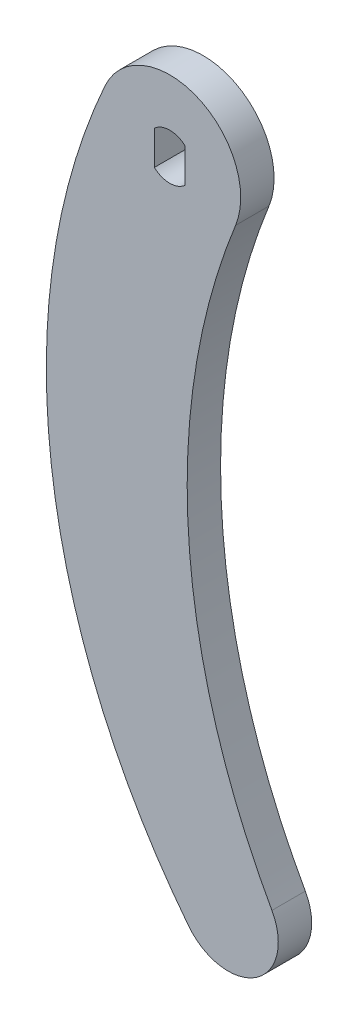
ISO-10303-21;
HEADER;
FILE_DESCRIPTION(('STEP AP214'),'2;1');
FILE_NAME('part.step','',(''),(''),'','','');
FILE_SCHEMA(('AUTOMOTIVE_DESIGN { 1 0 10303 214 1 1 1 1 }'));
ENDSEC;
DATA;
#1=APPLICATION_CONTEXT('core data for automotive mechanical design processes');
#2=APPLICATION_PROTOCOL_DEFINITION('international standard','automotive_design',2000,#1);
#3=PRODUCT_CONTEXT('',#1,'mechanical');
#4=PRODUCT('Part','Part','',(#3));
#5=PRODUCT_RELATED_PRODUCT_CATEGORY('part','',(#4));
#6=PRODUCT_DEFINITION_FORMATION('','',#4);
#7=PRODUCT_DEFINITION_CONTEXT('part definition',#1,'design');
#8=PRODUCT_DEFINITION('design','',#6,#7);
#9=PRODUCT_DEFINITION_SHAPE('','',#8);
#10=(LENGTH_UNIT() NAMED_UNIT(*) SI_UNIT(.MILLI.,.METRE.));
#11=(NAMED_UNIT(*) PLANE_ANGLE_UNIT() SI_UNIT($,.RADIAN.));
#12=(NAMED_UNIT(*) SI_UNIT($,.STERADIAN.) SOLID_ANGLE_UNIT());
#13=UNCERTAINTY_MEASURE_WITH_UNIT(LENGTH_MEASURE(1.E-05),#10,'distance_accuracy_value','');
#14=(GEOMETRIC_REPRESENTATION_CONTEXT(3) GLOBAL_UNCERTAINTY_ASSIGNED_CONTEXT((#13)) GLOBAL_UNIT_ASSIGNED_CONTEXT((#10,
#11,#12)) REPRESENTATION_CONTEXT('',''));
#15=CARTESIAN_POINT('',(0.,0.,0.));
#16=DIRECTION('',(0.,0.,1.));
#17=DIRECTION('',(1.,0.,0.));
#18=AXIS2_PLACEMENT_3D('',#15,#16,#17);
#19=CARTESIAN_POINT('',(44.5438637378374,-54.0367393844685,4.));
#20=DIRECTION('',(0.,0.,1.));
#21=DIRECTION('',(1.,0.,0.));
#22=AXIS2_PLACEMENT_3D('',#19,#20,#21);
#23=PLANE('',#22);
#24=CARTESIAN_POINT('',(82.0877274756749,-33.073478768937,4.));
#25=DIRECTION('',(0.,0.,-1.));
#26=DIRECTION('',(1.,0.,0.));
#27=AXIS2_PLACEMENT_3D('',#24,#25,#26);
#28=CIRCLE('',#27,80.);
#29=CARTESIAN_POINT('',(12.2386786610936,-72.0748938676003,4.));
#30=VERTEX_POINT('',#29);
#31=CARTESIAN_POINT('',(7.88413201743768,-3.17654880831597,4.));
#32=VERTEX_POINT('',#31);
#33=EDGE_CURVE('E135',#30,#32,#28,.T.);
#34=ORIENTED_EDGE('',*,*,#33,.T.);
#35=CARTESIAN_POINT('',(0.,0.,4.));
#36=DIRECTION('',(0.,0.,1.));
#37=DIRECTION('',(1.,0.,0.));
#38=AXIS2_PLACEMENT_3D('',#35,#36,#37);
#39=CIRCLE('',#38,8.49999999999997);
#40=CARTESIAN_POINT('',(-7.75272605003724,3.48500197891959,4.));
#41=VERTEX_POINT('',#40);
#42=EDGE_CURVE('E138',#32,#41,#39,.T.);
#43=ORIENTED_EDGE('',*,*,#42,.T.);
#44=CARTESIAN_POINT('',(65.2141073620782,-29.315016646206,4.));
#45=DIRECTION('',(0.,0.,1.));
#46=DIRECTION('',(1.,0.,0.));
#47=AXIS2_PLACEMENT_3D('',#44,#45,#46);
#48=CIRCLE('',#47,80.);
#49=CARTESIAN_POINT('',(2.27993724091256,-78.7041878394968,4.));
#50=VERTEX_POINT('',#49);
#51=EDGE_CURVE('E141',#41,#50,#48,.T.);
#52=ORIENTED_EDGE('',*,*,#51,.T.);
#53=CARTESIAN_POINT('',(7.00000000000001,-75.,4.));
#54=DIRECTION('',(0.,0.,1.));
#55=DIRECTION('',(1.,0.,0.));
#56=AXIS2_PLACEMENT_3D('',#53,#54,#55);
#57=CIRCLE('',#56,5.99999999999999);
#58=EDGE_CURVE('E143',#50,#30,#57,.T.);
#59=ORIENTED_EDGE('',*,*,#58,.T.);
#60=EDGE_LOOP('',(#34,#43,#52,#59));
#61=FACE_BOUND('',#60,.T.);
#62=DIRECTION('',(0.,-1.,0.));
#63=VECTOR('',#62,1.);
#64=CARTESIAN_POINT('',(-1.85,-2.04,4.));
#65=LINE('',#64,#63);
#66=CARTESIAN_POINT('',(-1.85,2.04,4.));
#67=VERTEX_POINT('',#66);
#68=CARTESIAN_POINT('',(-1.85,-2.04,4.));
#69=VERTEX_POINT('',#68);
#70=EDGE_CURVE('E107',#67,#69,#65,.T.);
#71=ORIENTED_EDGE('',*,*,#70,.F.);
#72=CARTESIAN_POINT('',(0.,0.,4.));
#73=DIRECTION('',(0.,0.,1.));
#74=DIRECTION('',(1.,0.,0.));
#75=AXIS2_PLACEMENT_3D('',#72,#73,#74);
#76=CIRCLE('',#75,2.75392447245744);
#77=CARTESIAN_POINT('',(1.85,2.04,4.));
#78=VERTEX_POINT('',#77);
#79=EDGE_CURVE('E99',#78,#67,#76,.T.);
#80=ORIENTED_EDGE('',*,*,#79,.F.);
#81=DIRECTION('',(0.,1.,0.));
#82=VECTOR('',#81,1.);
#83=CARTESIAN_POINT('',(1.85,-2.04,4.));
#84=LINE('',#83,#82);
#85=CARTESIAN_POINT('',(1.85,-2.04,4.));
#86=VERTEX_POINT('',#85);
#87=EDGE_CURVE('E121',#86,#78,#84,.T.);
#88=ORIENTED_EDGE('',*,*,#87,.F.);
#89=CARTESIAN_POINT('',(0.,0.,4.));
#90=DIRECTION('',(0.,0.,1.));
#91=DIRECTION('',(1.,0.,0.));
#92=AXIS2_PLACEMENT_3D('',#89,#90,#91);
#93=CIRCLE('',#92,2.75392447245744);
#94=EDGE_CURVE('E119',#69,#86,#93,.T.);
#95=ORIENTED_EDGE('',*,*,#94,.F.);
#96=EDGE_LOOP('',(#71,#80,#88,#95));
#97=FACE_BOUND('',#96,.T.);
#98=ADVANCED_FACE('F34',(#61,#97),#23,.T.);
#99=CARTESIAN_POINT('',(44.5438637378374,-54.0367393844685,0.));
#100=DIRECTION('',(0.,0.,1.));
#101=DIRECTION('',(1.,0.,0.));
#102=AXIS2_PLACEMENT_3D('',#99,#100,#101);
#103=PLANE('',#102);
#104=CARTESIAN_POINT('',(82.0877274756749,-33.073478768937,0.));
#105=DIRECTION('',(0.,0.,-1.));
#106=DIRECTION('',(1.,0.,0.));
#107=AXIS2_PLACEMENT_3D('',#104,#105,#106);
#108=CIRCLE('',#107,80.);
#109=CARTESIAN_POINT('',(12.2386786610936,-72.0748938676003,0.));
#110=VERTEX_POINT('',#109);
#111=CARTESIAN_POINT('',(7.88413201743768,-3.17654880831597,0.));
#112=VERTEX_POINT('',#111);
#113=EDGE_CURVE('E115',#110,#112,#108,.T.);
#114=ORIENTED_EDGE('',*,*,#113,.F.);
#115=CARTESIAN_POINT('',(7.00000000000001,-75.,0.));
#116=DIRECTION('',(0.,0.,1.));
#117=DIRECTION('',(1.,0.,0.));
#118=AXIS2_PLACEMENT_3D('',#115,#116,#117);
#119=CIRCLE('',#118,5.99999999999999);
#120=CARTESIAN_POINT('',(2.27993724091256,-78.7041878394968,0.));
#121=VERTEX_POINT('',#120);
#122=EDGE_CURVE('E139',#121,#110,#119,.T.);
#123=ORIENTED_EDGE('',*,*,#122,.F.);
#124=CARTESIAN_POINT('',(65.2141073620782,-29.315016646206,0.));
#125=DIRECTION('',(0.,0.,1.));
#126=DIRECTION('',(1.,0.,0.));
#127=AXIS2_PLACEMENT_3D('',#124,#125,#126);
#128=CIRCLE('',#127,80.);
#129=CARTESIAN_POINT('',(-7.75272605003724,3.48500197891959,0.));
#130=VERTEX_POINT('',#129);
#131=EDGE_CURVE('E150',#130,#121,#128,.T.);
#132=ORIENTED_EDGE('',*,*,#131,.F.);
#133=CARTESIAN_POINT('',(0.,0.,0.));
#134=DIRECTION('',(0.,0.,1.));
#135=DIRECTION('',(1.,0.,0.));
#136=AXIS2_PLACEMENT_3D('',#133,#134,#135);
#137=CIRCLE('',#136,8.49999999999997);
#138=EDGE_CURVE('E148',#112,#130,#137,.T.);
#139=ORIENTED_EDGE('',*,*,#138,.F.);
#140=EDGE_LOOP('',(#114,#123,#132,#139));
#141=FACE_BOUND('',#140,.T.);
#142=CARTESIAN_POINT('',(0.,0.,0.));
#143=DIRECTION('',(0.,0.,1.));
#144=DIRECTION('',(1.,0.,0.));
#145=AXIS2_PLACEMENT_3D('',#142,#143,#144);
#146=CIRCLE('',#145,2.75392447245744);
#147=CARTESIAN_POINT('',(1.85,2.04,0.));
#148=VERTEX_POINT('',#147);
#149=CARTESIAN_POINT('',(-1.85,2.04,0.));
#150=VERTEX_POINT('',#149);
#151=EDGE_CURVE('E57',#148,#150,#146,.T.);
#152=ORIENTED_EDGE('',*,*,#151,.T.);
#153=DIRECTION('',(0.,-1.,0.));
#154=VECTOR('',#153,1.);
#155=CARTESIAN_POINT('',(-1.85,-2.04,0.));
#156=LINE('',#155,#154);
#157=CARTESIAN_POINT('',(-1.85,-2.04,0.));
#158=VERTEX_POINT('',#157);
#159=EDGE_CURVE('E114',#150,#158,#156,.T.);
#160=ORIENTED_EDGE('',*,*,#159,.T.);
#161=CARTESIAN_POINT('',(0.,0.,0.));
#162=DIRECTION('',(0.,0.,1.));
#163=DIRECTION('',(1.,0.,0.));
#164=AXIS2_PLACEMENT_3D('',#161,#162,#163);
#165=CIRCLE('',#164,2.75392447245744);
#166=CARTESIAN_POINT('',(1.85,-2.04,0.));
#167=VERTEX_POINT('',#166);
#168=EDGE_CURVE('E127',#158,#167,#165,.T.);
#169=ORIENTED_EDGE('',*,*,#168,.T.);
#170=DIRECTION('',(0.,1.,0.));
#171=VECTOR('',#170,1.);
#172=CARTESIAN_POINT('',(1.85,-2.04,0.));
#173=LINE('',#172,#171);
#174=EDGE_CURVE('E108',#167,#148,#173,.T.);
#175=ORIENTED_EDGE('',*,*,#174,.T.);
#176=EDGE_LOOP('',(#152,#160,#169,#175));
#177=FACE_BOUND('',#176,.T.);
#178=ADVANCED_FACE('F168',(#141,#177),#103,.F.);
#179=CARTESIAN_POINT('',(82.0877274756749,-33.073478768937,4.));
#180=DIRECTION('',(0.,0.,-1.));
#181=DIRECTION('',(-1.,0.,0.));
#182=AXIS2_PLACEMENT_3D('',#179,#180,#181);
#183=CYLINDRICAL_SURFACE('',#182,80.);
#184=ORIENTED_EDGE('',*,*,#113,.T.);
#185=DIRECTION('',(0.,0.,-1.));
#186=VECTOR('',#185,1.);
#187=CARTESIAN_POINT('',(7.88413201743768,-3.17654880831597,4.));
#188=LINE('',#187,#186);
#189=EDGE_CURVE('E11',#32,#112,#188,.T.);
#190=ORIENTED_EDGE('',*,*,#189,.F.);
#191=ORIENTED_EDGE('',*,*,#33,.F.);
#192=DIRECTION('',(0.,0.,-1.));
#193=VECTOR('',#192,1.);
#194=CARTESIAN_POINT('',(12.2386786610936,-72.0748938676003,4.));
#195=LINE('',#194,#193);
#196=EDGE_CURVE('E145',#30,#110,#195,.T.);
#197=ORIENTED_EDGE('',*,*,#196,.T.);
#198=EDGE_LOOP('',(#184,#190,#191,#197));
#199=FACE_BOUND('',#198,.T.);
#200=ADVANCED_FACE('F36',(#199),#183,.F.);
#201=CARTESIAN_POINT('',(0.,0.,4.));
#202=DIRECTION('',(0.,0.,-1.));
#203=DIRECTION('',(-1.,0.,0.));
#204=AXIS2_PLACEMENT_3D('',#201,#202,#203);
#205=CYLINDRICAL_SURFACE('',#204,8.49999999999997);
#206=ORIENTED_EDGE('',*,*,#138,.T.);
#207=DIRECTION('',(0.,0.,-1.));
#208=VECTOR('',#207,1.);
#209=CARTESIAN_POINT('',(-7.75272605003724,3.48500197891959,4.));
#210=LINE('',#209,#208);
#211=EDGE_CURVE('E42',#41,#130,#210,.T.);
#212=ORIENTED_EDGE('',*,*,#211,.F.);
#213=ORIENTED_EDGE('',*,*,#42,.F.);
#214=ORIENTED_EDGE('',*,*,#189,.T.);
#215=EDGE_LOOP('',(#206,#212,#213,#214));
#216=FACE_BOUND('',#215,.T.);
#217=ADVANCED_FACE('F178',(#216),#205,.T.);
#218=CARTESIAN_POINT('',(65.2141073620782,-29.315016646206,4.));
#219=DIRECTION('',(0.,0.,-1.));
#220=DIRECTION('',(-1.,0.,0.));
#221=AXIS2_PLACEMENT_3D('',#218,#219,#220);
#222=CYLINDRICAL_SURFACE('',#221,80.);
#223=ORIENTED_EDGE('',*,*,#131,.T.);
#224=DIRECTION('',(0.,0.,-1.));
#225=VECTOR('',#224,1.);
#226=CARTESIAN_POINT('',(2.27993724091256,-78.7041878394968,4.));
#227=LINE('',#226,#225);
#228=EDGE_CURVE('E155',#50,#121,#227,.T.);
#229=ORIENTED_EDGE('',*,*,#228,.F.);
#230=ORIENTED_EDGE('',*,*,#51,.F.);
#231=ORIENTED_EDGE('',*,*,#211,.T.);
#232=EDGE_LOOP('',(#223,#229,#230,#231));
#233=FACE_BOUND('',#232,.T.);
#234=ADVANCED_FACE('F162',(#233),#222,.T.);
#235=CARTESIAN_POINT('',(7.00000000000001,-75.,4.));
#236=DIRECTION('',(0.,0.,-1.));
#237=DIRECTION('',(-1.,0.,0.));
#238=AXIS2_PLACEMENT_3D('',#235,#236,#237);
#239=CYLINDRICAL_SURFACE('',#238,5.99999999999999);
#240=ORIENTED_EDGE('',*,*,#122,.T.);
#241=ORIENTED_EDGE('',*,*,#196,.F.);
#242=ORIENTED_EDGE('',*,*,#58,.F.);
#243=ORIENTED_EDGE('',*,*,#228,.T.);
#244=EDGE_LOOP('',(#240,#241,#242,#243));
#245=FACE_BOUND('',#244,.T.);
#246=ADVANCED_FACE('F172',(#245),#239,.T.);
#247=CARTESIAN_POINT('',(0.,0.,4.));
#248=DIRECTION('',(0.,0.,-1.));
#249=DIRECTION('',(-1.,0.,0.));
#250=AXIS2_PLACEMENT_3D('',#247,#248,#249);
#251=CYLINDRICAL_SURFACE('',#250,2.75392447245744);
#252=ORIENTED_EDGE('',*,*,#151,.F.);
#253=DIRECTION('',(0.,0.,-1.));
#254=VECTOR('',#253,1.);
#255=CARTESIAN_POINT('',(1.85,2.04,4.));
#256=LINE('',#255,#254);
#257=EDGE_CURVE('E103',#78,#148,#256,.T.);
#258=ORIENTED_EDGE('',*,*,#257,.F.);
#259=ORIENTED_EDGE('',*,*,#79,.T.);
#260=DIRECTION('',(0.,0.,-1.));
#261=VECTOR('',#260,1.);
#262=CARTESIAN_POINT('',(-1.85,2.04,4.));
#263=LINE('',#262,#261);
#264=EDGE_CURVE('E102',#67,#150,#263,.T.);
#265=ORIENTED_EDGE('',*,*,#264,.T.);
#266=EDGE_LOOP('',(#252,#258,#259,#265));
#267=FACE_BOUND('',#266,.T.);
#268=ADVANCED_FACE('F101',(#267),#251,.F.);
#269=CARTESIAN_POINT('',(-1.85,-2.04,4.));
#270=DIRECTION('',(1.,0.,0.));
#271=DIRECTION('',(0.,0.,-1.));
#272=AXIS2_PLACEMENT_3D('',#269,#270,#271);
#273=PLANE('',#272);
#274=ORIENTED_EDGE('',*,*,#159,.F.);
#275=ORIENTED_EDGE('',*,*,#264,.F.);
#276=ORIENTED_EDGE('',*,*,#70,.T.);
#277=DIRECTION('',(0.,0.,-1.));
#278=VECTOR('',#277,1.);
#279=CARTESIAN_POINT('',(-1.85,-2.04,4.));
#280=LINE('',#279,#278);
#281=EDGE_CURVE('E116',#69,#158,#280,.T.);
#282=ORIENTED_EDGE('',*,*,#281,.T.);
#283=EDGE_LOOP('',(#274,#275,#276,#282));
#284=FACE_BOUND('',#283,.T.);
#285=ADVANCED_FACE('F111',(#284),#273,.T.);
#286=CARTESIAN_POINT('',(0.,0.,4.));
#287=DIRECTION('',(0.,0.,-1.));
#288=DIRECTION('',(-1.,0.,0.));
#289=AXIS2_PLACEMENT_3D('',#286,#287,#288);
#290=CYLINDRICAL_SURFACE('',#289,2.75392447245744);
#291=ORIENTED_EDGE('',*,*,#168,.F.);
#292=ORIENTED_EDGE('',*,*,#281,.F.);
#293=ORIENTED_EDGE('',*,*,#94,.T.);
#294=DIRECTION('',(0.,0.,-1.));
#295=VECTOR('',#294,1.);
#296=CARTESIAN_POINT('',(1.85,-2.04,4.));
#297=LINE('',#296,#295);
#298=EDGE_CURVE('E49',#86,#167,#297,.T.);
#299=ORIENTED_EDGE('',*,*,#298,.T.);
#300=EDGE_LOOP('',(#291,#292,#293,#299));
#301=FACE_BOUND('',#300,.T.);
#302=ADVANCED_FACE('F201',(#301),#290,.F.);
#303=CARTESIAN_POINT('',(1.85,-2.04,4.));
#304=DIRECTION('',(-1.,0.,0.));
#305=DIRECTION('',(0.,0.,1.));
#306=AXIS2_PLACEMENT_3D('',#303,#304,#305);
#307=PLANE('',#306);
#308=ORIENTED_EDGE('',*,*,#174,.F.);
#309=ORIENTED_EDGE('',*,*,#298,.F.);
#310=ORIENTED_EDGE('',*,*,#87,.T.);
#311=ORIENTED_EDGE('',*,*,#257,.T.);
#312=EDGE_LOOP('',(#308,#309,#310,#311));
#313=FACE_BOUND('',#312,.T.);
#314=ADVANCED_FACE('F205',(#313),#307,.T.);
#315=CLOSED_SHELL('',(#98,#178,#200,#217,#234,#246,#268,#285,#302,#314));
#316=MANIFOLD_SOLID_BREP('B2',#315);
#317=ADVANCED_BREP_SHAPE_REPRESENTATION('',(#18,#316),#14);
#318=SHAPE_DEFINITION_REPRESENTATION(#9,#317);
ENDSEC;
END-ISO-10303-21;
